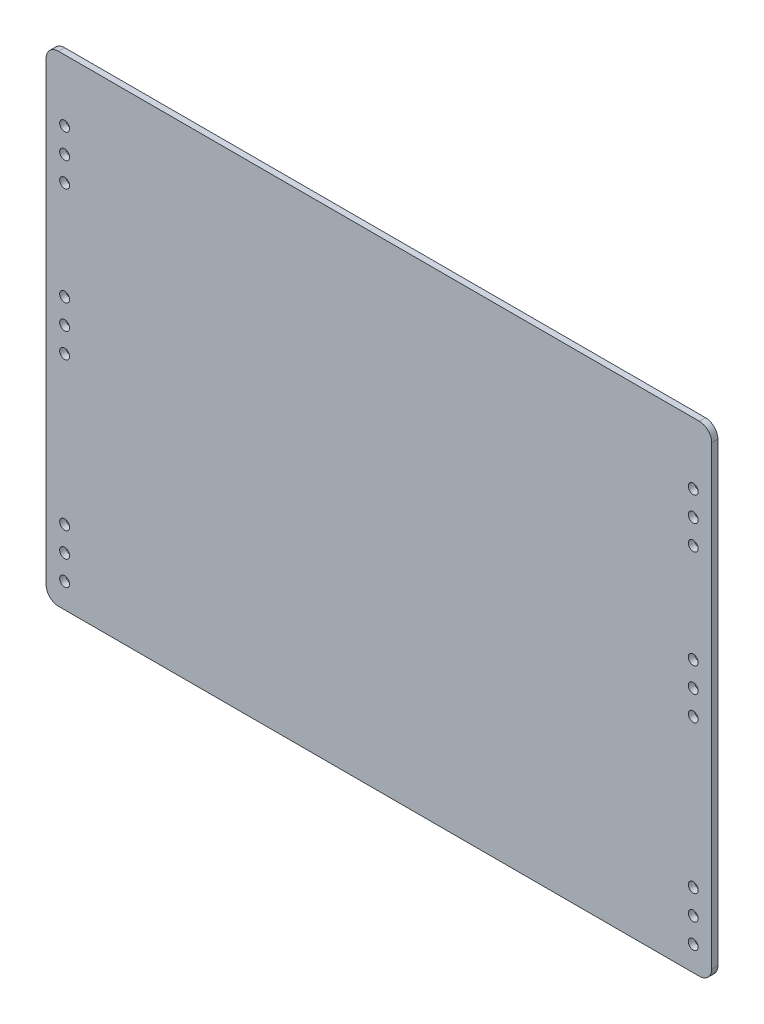
ISO-10303-21;
HEADER;
FILE_DESCRIPTION(('STEP AP214'),'2;1');
FILE_NAME('part.step','',(''),(''),'','','');
FILE_SCHEMA(('AUTOMOTIVE_DESIGN { 1 0 10303 214 1 1 1 1 }'));
ENDSEC;
DATA;
#1=APPLICATION_CONTEXT('core data for automotive mechanical design processes');
#2=APPLICATION_PROTOCOL_DEFINITION('international standard','automotive_design',2000,#1);
#3=PRODUCT_CONTEXT('',#1,'mechanical');
#4=PRODUCT('Part','Part','',(#3));
#5=PRODUCT_RELATED_PRODUCT_CATEGORY('part','',(#4));
#6=PRODUCT_DEFINITION_FORMATION('','',#4);
#7=PRODUCT_DEFINITION_CONTEXT('part definition',#1,'design');
#8=PRODUCT_DEFINITION('design','',#6,#7);
#9=PRODUCT_DEFINITION_SHAPE('','',#8);
#10=(LENGTH_UNIT() NAMED_UNIT(*) SI_UNIT(.MILLI.,.METRE.));
#11=(NAMED_UNIT(*) PLANE_ANGLE_UNIT() SI_UNIT($,.RADIAN.));
#12=(NAMED_UNIT(*) SI_UNIT($,.STERADIAN.) SOLID_ANGLE_UNIT());
#13=UNCERTAINTY_MEASURE_WITH_UNIT(LENGTH_MEASURE(1.E-05),#10,'distance_accuracy_value','');
#14=(GEOMETRIC_REPRESENTATION_CONTEXT(3) GLOBAL_UNCERTAINTY_ASSIGNED_CONTEXT((#13)) GLOBAL_UNIT_ASSIGNED_CONTEXT((#10,
#11,#12)) REPRESENTATION_CONTEXT('',''));
#15=CARTESIAN_POINT('',(0.,0.,0.));
#16=DIRECTION('',(0.,0.,1.));
#17=DIRECTION('',(1.,0.,0.));
#18=AXIS2_PLACEMENT_3D('',#15,#16,#17);
#19=CARTESIAN_POINT('',(0.,0.,-3.175));
#20=DIRECTION('',(0.,0.,1.));
#21=DIRECTION('',(-1.,0.,0.));
#22=AXIS2_PLACEMENT_3D('',#19,#20,#21);
#23=PLANE('',#22);
#24=DIRECTION('',(-1.,0.,0.));
#25=VECTOR('',#24,1.);
#26=CARTESIAN_POINT('',(0.,247.65,-3.175));
#27=LINE('',#26,#25);
#28=CARTESIAN_POINT('',(336.55,247.65,-3.175));
#29=VERTEX_POINT('',#28);
#30=CARTESIAN_POINT('',(6.35,247.65,-3.175));
#31=VERTEX_POINT('',#30);
#32=EDGE_CURVE('E138',#29,#31,#27,.T.);
#33=ORIENTED_EDGE('',*,*,#32,.F.);
#34=CARTESIAN_POINT('',(336.55,241.3,-3.175));
#35=DIRECTION('',(0.,0.,-1.));
#36=DIRECTION('',(-1.,0.,0.));
#37=AXIS2_PLACEMENT_3D('',#34,#35,#36);
#38=CIRCLE('',#37,6.35);
#39=CARTESIAN_POINT('',(342.9,241.3,-3.175));
#40=VERTEX_POINT('',#39);
#41=EDGE_CURVE('E154',#40,#29,#38,.F.);
#42=ORIENTED_EDGE('',*,*,#41,.F.);
#43=DIRECTION('',(0.,1.,0.));
#44=VECTOR('',#43,1.);
#45=CARTESIAN_POINT('',(342.9,0.,-3.175));
#46=LINE('',#45,#44);
#47=CARTESIAN_POINT('',(342.9,6.35,-3.175));
#48=VERTEX_POINT('',#47);
#49=EDGE_CURVE('E177',#48,#40,#46,.T.);
#50=ORIENTED_EDGE('',*,*,#49,.F.);
#51=CARTESIAN_POINT('',(336.55,6.35,-3.175));
#52=DIRECTION('',(0.,0.,-1.));
#53=DIRECTION('',(-1.,0.,0.));
#54=AXIS2_PLACEMENT_3D('',#51,#52,#53);
#55=CIRCLE('',#54,6.35);
#56=CARTESIAN_POINT('',(336.55,0.,-3.175));
#57=VERTEX_POINT('',#56);
#58=EDGE_CURVE('E159',#57,#48,#55,.F.);
#59=ORIENTED_EDGE('',*,*,#58,.F.);
#60=DIRECTION('',(1.,0.,0.));
#61=VECTOR('',#60,1.);
#62=CARTESIAN_POINT('',(0.,0.,-3.175));
#63=LINE('',#62,#61);
#64=CARTESIAN_POINT('',(6.35,0.,-3.175));
#65=VERTEX_POINT('',#64);
#66=EDGE_CURVE('E185',#65,#57,#63,.T.);
#67=ORIENTED_EDGE('',*,*,#66,.F.);
#68=CARTESIAN_POINT('',(6.35,6.35,-3.175));
#69=DIRECTION('',(0.,0.,-1.));
#70=DIRECTION('',(-1.,0.,0.));
#71=AXIS2_PLACEMENT_3D('',#68,#69,#70);
#72=CIRCLE('',#71,6.35);
#73=CARTESIAN_POINT('',(0.,6.35,-3.175));
#74=VERTEX_POINT('',#73);
#75=EDGE_CURVE('E156',#74,#65,#72,.F.);
#76=ORIENTED_EDGE('',*,*,#75,.F.);
#77=DIRECTION('',(0.,-1.,0.));
#78=VECTOR('',#77,1.);
#79=CARTESIAN_POINT('',(0.,0.,-3.175));
#80=LINE('',#79,#78);
#81=CARTESIAN_POINT('',(0.,241.3,-3.175));
#82=VERTEX_POINT('',#81);
#83=EDGE_CURVE('E144',#82,#74,#80,.T.);
#84=ORIENTED_EDGE('',*,*,#83,.F.);
#85=CARTESIAN_POINT('',(6.35,241.3,-3.175));
#86=DIRECTION('',(0.,0.,-1.));
#87=DIRECTION('',(-1.,0.,0.));
#88=AXIS2_PLACEMENT_3D('',#85,#86,#87);
#89=CIRCLE('',#88,6.35);
#90=EDGE_CURVE('E106',#31,#82,#89,.F.);
#91=ORIENTED_EDGE('',*,*,#90,.F.);
#92=EDGE_LOOP('',(#33,#42,#50,#59,#67,#76,#84,#91));
#93=FACE_BOUND('',#92,.T.);
#94=CARTESIAN_POINT('',(9.52500000000003,12.7000000000001,-3.175));
#95=DIRECTION('',(0.,0.,1.));
#96=DIRECTION('',(1.,0.,0.));
#97=AXIS2_PLACEMENT_3D('',#94,#95,#96);
#98=CIRCLE('',#97,2.5527);
#99=CARTESIAN_POINT('',(12.0777,12.7000000000001,-3.175));
#100=VERTEX_POINT('',#99);
#101=EDGE_CURVE('E129',#100,#100,#98,.T.);
#102=ORIENTED_EDGE('',*,*,#101,.T.);
#103=EDGE_LOOP('',(#102));
#104=FACE_BOUND('',#103,.T.);
#105=CARTESIAN_POINT('',(9.52500000000003,25.4000000000001,-3.175));
#106=DIRECTION('',(0.,0.,1.));
#107=DIRECTION('',(1.,0.,0.));
#108=AXIS2_PLACEMENT_3D('',#105,#106,#107);
#109=CIRCLE('',#108,2.5527);
#110=CARTESIAN_POINT('',(12.0777,25.4000000000001,-3.175));
#111=VERTEX_POINT('',#110);
#112=EDGE_CURVE('E190',#111,#111,#109,.T.);
#113=ORIENTED_EDGE('',*,*,#112,.T.);
#114=EDGE_LOOP('',(#113));
#115=FACE_BOUND('',#114,.T.);
#116=CARTESIAN_POINT('',(9.52500000000003,38.1000000000001,-3.175));
#117=DIRECTION('',(0.,0.,1.));
#118=DIRECTION('',(1.,0.,0.));
#119=AXIS2_PLACEMENT_3D('',#116,#117,#118);
#120=CIRCLE('',#119,2.5527);
#121=CARTESIAN_POINT('',(12.0777,38.1000000000001,-3.175));
#122=VERTEX_POINT('',#121);
#123=EDGE_CURVE('E195',#122,#122,#120,.T.);
#124=ORIENTED_EDGE('',*,*,#123,.T.);
#125=EDGE_LOOP('',(#124));
#126=FACE_BOUND('',#125,.T.);
#127=CARTESIAN_POINT('',(9.52500000000002,114.3,-3.175));
#128=DIRECTION('',(0.,0.,1.));
#129=DIRECTION('',(1.,0.,0.));
#130=AXIS2_PLACEMENT_3D('',#127,#128,#129);
#131=CIRCLE('',#130,2.55269999999999);
#132=CARTESIAN_POINT('',(12.0777,114.3,-3.175));
#133=VERTEX_POINT('',#132);
#134=EDGE_CURVE('E201',#133,#133,#131,.T.);
#135=ORIENTED_EDGE('',*,*,#134,.T.);
#136=EDGE_LOOP('',(#135));
#137=FACE_BOUND('',#136,.T.);
#138=CARTESIAN_POINT('',(9.52500000000002,127.,-3.175));
#139=DIRECTION('',(0.,0.,1.));
#140=DIRECTION('',(1.,0.,0.));
#141=AXIS2_PLACEMENT_3D('',#138,#139,#140);
#142=CIRCLE('',#141,2.5527);
#143=CARTESIAN_POINT('',(12.0777,127.,-3.175));
#144=VERTEX_POINT('',#143);
#145=EDGE_CURVE('E207',#144,#144,#142,.T.);
#146=ORIENTED_EDGE('',*,*,#145,.T.);
#147=EDGE_LOOP('',(#146));
#148=FACE_BOUND('',#147,.T.);
#149=CARTESIAN_POINT('',(9.52500000000002,139.7,-3.175));
#150=DIRECTION('',(0.,0.,1.));
#151=DIRECTION('',(1.,0.,0.));
#152=AXIS2_PLACEMENT_3D('',#149,#150,#151);
#153=CIRCLE('',#152,2.55270000000001);
#154=CARTESIAN_POINT('',(12.0777,139.7,-3.175));
#155=VERTEX_POINT('',#154);
#156=EDGE_CURVE('E213',#155,#155,#153,.T.);
#157=ORIENTED_EDGE('',*,*,#156,.T.);
#158=EDGE_LOOP('',(#157));
#159=FACE_BOUND('',#158,.T.);
#160=CARTESIAN_POINT('',(9.52500000000001,215.9,-3.175));
#161=DIRECTION('',(0.,0.,1.));
#162=DIRECTION('',(1.,0.,0.));
#163=AXIS2_PLACEMENT_3D('',#160,#161,#162);
#164=CIRCLE('',#163,2.55270000000001);
#165=CARTESIAN_POINT('',(12.0777,215.9,-3.175));
#166=VERTEX_POINT('',#165);
#167=EDGE_CURVE('E219',#166,#166,#164,.T.);
#168=ORIENTED_EDGE('',*,*,#167,.T.);
#169=EDGE_LOOP('',(#168));
#170=FACE_BOUND('',#169,.T.);
#171=CARTESIAN_POINT('',(9.52500000000001,203.2,-3.175));
#172=DIRECTION('',(0.,0.,1.));
#173=DIRECTION('',(1.,0.,0.));
#174=AXIS2_PLACEMENT_3D('',#171,#172,#173);
#175=CIRCLE('',#174,2.55270000000001);
#176=CARTESIAN_POINT('',(12.0777,203.2,-3.175));
#177=VERTEX_POINT('',#176);
#178=EDGE_CURVE('E225',#177,#177,#175,.T.);
#179=ORIENTED_EDGE('',*,*,#178,.T.);
#180=EDGE_LOOP('',(#179));
#181=FACE_BOUND('',#180,.T.);
#182=CARTESIAN_POINT('',(9.52500000000001,190.5,-3.175));
#183=DIRECTION('',(0.,0.,1.));
#184=DIRECTION('',(1.,0.,0.));
#185=AXIS2_PLACEMENT_3D('',#182,#183,#184);
#186=CIRCLE('',#185,2.55270000000001);
#187=CARTESIAN_POINT('',(12.0777,190.5,-3.175));
#188=VERTEX_POINT('',#187);
#189=EDGE_CURVE('E231',#188,#188,#186,.T.);
#190=ORIENTED_EDGE('',*,*,#189,.T.);
#191=EDGE_LOOP('',(#190));
#192=FACE_BOUND('',#191,.T.);
#193=CARTESIAN_POINT('',(333.375,215.9,-3.175));
#194=DIRECTION('',(0.,0.,1.));
#195=DIRECTION('',(-1.,0.,0.));
#196=AXIS2_PLACEMENT_3D('',#193,#194,#195);
#197=CIRCLE('',#196,2.55269999999998);
#198=CARTESIAN_POINT('',(330.8223,215.9,-3.175));
#199=VERTEX_POINT('',#198);
#200=EDGE_CURVE('E237',#199,#199,#197,.T.);
#201=ORIENTED_EDGE('',*,*,#200,.T.);
#202=EDGE_LOOP('',(#201));
#203=FACE_BOUND('',#202,.T.);
#204=CARTESIAN_POINT('',(333.375,203.2,-3.175));
#205=DIRECTION('',(0.,0.,1.));
#206=DIRECTION('',(-1.,0.,0.));
#207=AXIS2_PLACEMENT_3D('',#204,#205,#206);
#208=CIRCLE('',#207,2.55269999999993);
#209=CARTESIAN_POINT('',(330.8223,203.2,-3.175));
#210=VERTEX_POINT('',#209);
#211=EDGE_CURVE('E243',#210,#210,#208,.T.);
#212=ORIENTED_EDGE('',*,*,#211,.T.);
#213=EDGE_LOOP('',(#212));
#214=FACE_BOUND('',#213,.T.);
#215=CARTESIAN_POINT('',(333.375,190.5,-3.175));
#216=DIRECTION('',(0.,0.,1.));
#217=DIRECTION('',(-1.,0.,0.));
#218=AXIS2_PLACEMENT_3D('',#215,#216,#217);
#219=CIRCLE('',#218,2.55269999999998);
#220=CARTESIAN_POINT('',(330.8223,190.5,-3.175));
#221=VERTEX_POINT('',#220);
#222=EDGE_CURVE('E249',#221,#221,#219,.T.);
#223=ORIENTED_EDGE('',*,*,#222,.T.);
#224=EDGE_LOOP('',(#223));
#225=FACE_BOUND('',#224,.T.);
#226=CARTESIAN_POINT('',(333.375,139.7,-3.175));
#227=DIRECTION('',(0.,0.,1.));
#228=DIRECTION('',(-1.,0.,0.));
#229=AXIS2_PLACEMENT_3D('',#226,#227,#228);
#230=CIRCLE('',#229,2.55270000000004);
#231=CARTESIAN_POINT('',(330.8223,139.7,-3.175));
#232=VERTEX_POINT('',#231);
#233=EDGE_CURVE('E255',#232,#232,#230,.T.);
#234=ORIENTED_EDGE('',*,*,#233,.T.);
#235=EDGE_LOOP('',(#234));
#236=FACE_BOUND('',#235,.T.);
#237=CARTESIAN_POINT('',(333.375,127.,-3.175));
#238=DIRECTION('',(0.,0.,1.));
#239=DIRECTION('',(-1.,0.,0.));
#240=AXIS2_PLACEMENT_3D('',#237,#238,#239);
#241=CIRCLE('',#240,2.55270000000004);
#242=CARTESIAN_POINT('',(330.8223,127.,-3.175));
#243=VERTEX_POINT('',#242);
#244=EDGE_CURVE('E261',#243,#243,#241,.T.);
#245=ORIENTED_EDGE('',*,*,#244,.T.);
#246=EDGE_LOOP('',(#245));
#247=FACE_BOUND('',#246,.T.);
#248=CARTESIAN_POINT('',(333.375,114.3,-3.175));
#249=DIRECTION('',(0.,0.,1.));
#250=DIRECTION('',(-1.,0.,0.));
#251=AXIS2_PLACEMENT_3D('',#248,#249,#250);
#252=CIRCLE('',#251,2.55270000000004);
#253=CARTESIAN_POINT('',(330.8223,114.3,-3.175));
#254=VERTEX_POINT('',#253);
#255=EDGE_CURVE('E267',#254,#254,#252,.T.);
#256=ORIENTED_EDGE('',*,*,#255,.T.);
#257=EDGE_LOOP('',(#256));
#258=FACE_BOUND('',#257,.T.);
#259=CARTESIAN_POINT('',(333.375,38.1000000000001,-3.175));
#260=DIRECTION('',(0.,0.,1.));
#261=DIRECTION('',(-1.,0.,0.));
#262=AXIS2_PLACEMENT_3D('',#259,#260,#261);
#263=CIRCLE('',#262,2.55269999999998);
#264=CARTESIAN_POINT('',(330.8223,38.1000000000001,-3.175));
#265=VERTEX_POINT('',#264);
#266=EDGE_CURVE('E273',#265,#265,#263,.T.);
#267=ORIENTED_EDGE('',*,*,#266,.T.);
#268=EDGE_LOOP('',(#267));
#269=FACE_BOUND('',#268,.T.);
#270=CARTESIAN_POINT('',(333.375,25.4000000000001,-3.175));
#271=DIRECTION('',(0.,0.,1.));
#272=DIRECTION('',(-1.,0.,0.));
#273=AXIS2_PLACEMENT_3D('',#270,#271,#272);
#274=CIRCLE('',#273,2.55269999999998);
#275=CARTESIAN_POINT('',(330.8223,25.4000000000001,-3.175));
#276=VERTEX_POINT('',#275);
#277=EDGE_CURVE('E279',#276,#276,#274,.T.);
#278=ORIENTED_EDGE('',*,*,#277,.T.);
#279=EDGE_LOOP('',(#278));
#280=FACE_BOUND('',#279,.T.);
#281=CARTESIAN_POINT('',(333.375,12.7000000000001,-3.175));
#282=DIRECTION('',(0.,0.,1.));
#283=DIRECTION('',(-1.,0.,0.));
#284=AXIS2_PLACEMENT_3D('',#281,#282,#283);
#285=CIRCLE('',#284,2.55269999999998);
#286=CARTESIAN_POINT('',(330.8223,12.7000000000001,-3.175));
#287=VERTEX_POINT('',#286);
#288=EDGE_CURVE('E285',#287,#287,#285,.T.);
#289=ORIENTED_EDGE('',*,*,#288,.T.);
#290=EDGE_LOOP('',(#289));
#291=FACE_BOUND('',#290,.T.);
#292=ADVANCED_FACE('F35',(#93,#104,#115,#126,#137,#148,#159,#170,#181,#192,#203,#214,#225,#236,
#247,#258,#269,#280,#291),#23,.F.);
#293=CARTESIAN_POINT('',(0.,0.,0.));
#294=DIRECTION('',(0.,0.,1.));
#295=DIRECTION('',(-1.,0.,0.));
#296=AXIS2_PLACEMENT_3D('',#293,#294,#295);
#297=PLANE('',#296);
#298=CARTESIAN_POINT('',(333.375,25.4000000000001,0.));
#299=DIRECTION('',(0.,0.,1.));
#300=DIRECTION('',(-1.,0.,0.));
#301=AXIS2_PLACEMENT_3D('',#298,#299,#300);
#302=CIRCLE('',#301,2.55269999999998);
#303=CARTESIAN_POINT('',(330.8223,25.4000000000001,0.));
#304=VERTEX_POINT('',#303);
#305=EDGE_CURVE('E282',#304,#304,#302,.T.);
#306=ORIENTED_EDGE('',*,*,#305,.F.);
#307=EDGE_LOOP('',(#306));
#308=FACE_BOUND('',#307,.T.);
#309=CARTESIAN_POINT('',(333.375,114.3,0.));
#310=DIRECTION('',(0.,0.,1.));
#311=DIRECTION('',(-1.,0.,0.));
#312=AXIS2_PLACEMENT_3D('',#309,#310,#311);
#313=CIRCLE('',#312,2.55270000000004);
#314=CARTESIAN_POINT('',(330.8223,114.3,0.));
#315=VERTEX_POINT('',#314);
#316=EDGE_CURVE('E270',#315,#315,#313,.T.);
#317=ORIENTED_EDGE('',*,*,#316,.F.);
#318=EDGE_LOOP('',(#317));
#319=FACE_BOUND('',#318,.T.);
#320=CARTESIAN_POINT('',(333.375,139.7,0.));
#321=DIRECTION('',(0.,0.,1.));
#322=DIRECTION('',(-1.,0.,0.));
#323=AXIS2_PLACEMENT_3D('',#320,#321,#322);
#324=CIRCLE('',#323,2.55270000000004);
#325=CARTESIAN_POINT('',(330.8223,139.7,0.));
#326=VERTEX_POINT('',#325);
#327=EDGE_CURVE('E258',#326,#326,#324,.T.);
#328=ORIENTED_EDGE('',*,*,#327,.F.);
#329=EDGE_LOOP('',(#328));
#330=FACE_BOUND('',#329,.T.);
#331=CARTESIAN_POINT('',(333.375,203.2,0.));
#332=DIRECTION('',(0.,0.,1.));
#333=DIRECTION('',(-1.,0.,0.));
#334=AXIS2_PLACEMENT_3D('',#331,#332,#333);
#335=CIRCLE('',#334,2.55269999999993);
#336=CARTESIAN_POINT('',(330.8223,203.2,0.));
#337=VERTEX_POINT('',#336);
#338=EDGE_CURVE('E246',#337,#337,#335,.T.);
#339=ORIENTED_EDGE('',*,*,#338,.F.);
#340=EDGE_LOOP('',(#339));
#341=FACE_BOUND('',#340,.T.);
#342=CARTESIAN_POINT('',(9.52500000000001,190.5,0.));
#343=DIRECTION('',(0.,0.,1.));
#344=DIRECTION('',(1.,0.,0.));
#345=AXIS2_PLACEMENT_3D('',#342,#343,#344);
#346=CIRCLE('',#345,2.55270000000001);
#347=CARTESIAN_POINT('',(12.0777,190.5,0.));
#348=VERTEX_POINT('',#347);
#349=EDGE_CURVE('E234',#348,#348,#346,.T.);
#350=ORIENTED_EDGE('',*,*,#349,.F.);
#351=EDGE_LOOP('',(#350));
#352=FACE_BOUND('',#351,.T.);
#353=CARTESIAN_POINT('',(9.52500000000001,215.9,0.));
#354=DIRECTION('',(0.,0.,1.));
#355=DIRECTION('',(1.,0.,0.));
#356=AXIS2_PLACEMENT_3D('',#353,#354,#355);
#357=CIRCLE('',#356,2.55270000000001);
#358=CARTESIAN_POINT('',(12.0777,215.9,0.));
#359=VERTEX_POINT('',#358);
#360=EDGE_CURVE('E222',#359,#359,#357,.T.);
#361=ORIENTED_EDGE('',*,*,#360,.F.);
#362=EDGE_LOOP('',(#361));
#363=FACE_BOUND('',#362,.T.);
#364=CARTESIAN_POINT('',(9.52500000000002,127.,0.));
#365=DIRECTION('',(0.,0.,1.));
#366=DIRECTION('',(1.,0.,0.));
#367=AXIS2_PLACEMENT_3D('',#364,#365,#366);
#368=CIRCLE('',#367,2.5527);
#369=CARTESIAN_POINT('',(12.0777,127.,0.));
#370=VERTEX_POINT('',#369);
#371=EDGE_CURVE('E210',#370,#370,#368,.T.);
#372=ORIENTED_EDGE('',*,*,#371,.F.);
#373=EDGE_LOOP('',(#372));
#374=FACE_BOUND('',#373,.T.);
#375=CARTESIAN_POINT('',(9.52500000000003,38.1000000000001,0.));
#376=DIRECTION('',(0.,0.,1.));
#377=DIRECTION('',(1.,0.,0.));
#378=AXIS2_PLACEMENT_3D('',#375,#376,#377);
#379=CIRCLE('',#378,2.5527);
#380=CARTESIAN_POINT('',(12.0777,38.1000000000001,0.));
#381=VERTEX_POINT('',#380);
#382=EDGE_CURVE('E198',#381,#381,#379,.T.);
#383=ORIENTED_EDGE('',*,*,#382,.F.);
#384=EDGE_LOOP('',(#383));
#385=FACE_BOUND('',#384,.T.);
#386=CARTESIAN_POINT('',(9.52500000000003,12.7000000000001,0.));
#387=DIRECTION('',(0.,0.,1.));
#388=DIRECTION('',(1.,0.,0.));
#389=AXIS2_PLACEMENT_3D('',#386,#387,#388);
#390=CIRCLE('',#389,2.5527);
#391=CARTESIAN_POINT('',(12.0777,12.7000000000001,0.));
#392=VERTEX_POINT('',#391);
#393=EDGE_CURVE('E135',#392,#392,#390,.T.);
#394=ORIENTED_EDGE('',*,*,#393,.F.);
#395=EDGE_LOOP('',(#394));
#396=FACE_BOUND('',#395,.T.);
#397=DIRECTION('',(0.,-1.,0.));
#398=VECTOR('',#397,1.);
#399=CARTESIAN_POINT('',(0.,0.,0.));
#400=LINE('',#399,#398);
#401=CARTESIAN_POINT('',(0.,241.3,0.));
#402=VERTEX_POINT('',#401);
#403=CARTESIAN_POINT('',(0.,6.35,0.));
#404=VERTEX_POINT('',#403);
#405=EDGE_CURVE('E119',#402,#404,#400,.T.);
#406=ORIENTED_EDGE('',*,*,#405,.T.);
#407=CARTESIAN_POINT('',(6.35,6.35,0.));
#408=DIRECTION('',(0.,0.,-1.));
#409=DIRECTION('',(-1.,0.,0.));
#410=AXIS2_PLACEMENT_3D('',#407,#408,#409);
#411=CIRCLE('',#410,6.35);
#412=CARTESIAN_POINT('',(6.35,0.,0.));
#413=VERTEX_POINT('',#412);
#414=EDGE_CURVE('E147',#413,#404,#411,.T.);
#415=ORIENTED_EDGE('',*,*,#414,.F.);
#416=DIRECTION('',(1.,0.,0.));
#417=VECTOR('',#416,1.);
#418=CARTESIAN_POINT('',(0.,0.,0.));
#419=LINE('',#418,#417);
#420=CARTESIAN_POINT('',(336.55,0.,0.));
#421=VERTEX_POINT('',#420);
#422=EDGE_CURVE('E128',#413,#421,#419,.T.);
#423=ORIENTED_EDGE('',*,*,#422,.T.);
#424=CARTESIAN_POINT('',(336.55,6.35,0.));
#425=DIRECTION('',(0.,0.,-1.));
#426=DIRECTION('',(-1.,0.,0.));
#427=AXIS2_PLACEMENT_3D('',#424,#425,#426);
#428=CIRCLE('',#427,6.35);
#429=CARTESIAN_POINT('',(342.9,6.35,0.));
#430=VERTEX_POINT('',#429);
#431=EDGE_CURVE('E124',#430,#421,#428,.T.);
#432=ORIENTED_EDGE('',*,*,#431,.F.);
#433=DIRECTION('',(0.,1.,0.));
#434=VECTOR('',#433,1.);
#435=CARTESIAN_POINT('',(342.9,0.,0.));
#436=LINE('',#435,#434);
#437=CARTESIAN_POINT('',(342.9,241.3,0.));
#438=VERTEX_POINT('',#437);
#439=EDGE_CURVE('E132',#430,#438,#436,.T.);
#440=ORIENTED_EDGE('',*,*,#439,.T.);
#441=CARTESIAN_POINT('',(336.55,241.3,0.));
#442=DIRECTION('',(0.,0.,-1.));
#443=DIRECTION('',(-1.,0.,0.));
#444=AXIS2_PLACEMENT_3D('',#441,#442,#443);
#445=CIRCLE('',#444,6.35);
#446=CARTESIAN_POINT('',(336.55,247.65,0.));
#447=VERTEX_POINT('',#446);
#448=EDGE_CURVE('E111',#447,#438,#445,.T.);
#449=ORIENTED_EDGE('',*,*,#448,.F.);
#450=DIRECTION('',(-1.,0.,0.));
#451=VECTOR('',#450,1.);
#452=CARTESIAN_POINT('',(0.,247.65,0.));
#453=LINE('',#452,#451);
#454=CARTESIAN_POINT('',(6.35,247.65,0.));
#455=VERTEX_POINT('',#454);
#456=EDGE_CURVE('E122',#447,#455,#453,.T.);
#457=ORIENTED_EDGE('',*,*,#456,.T.);
#458=CARTESIAN_POINT('',(6.35,241.3,0.));
#459=DIRECTION('',(0.,0.,-1.));
#460=DIRECTION('',(-1.,0.,0.));
#461=AXIS2_PLACEMENT_3D('',#458,#459,#460);
#462=CIRCLE('',#461,6.35);
#463=EDGE_CURVE('E103',#402,#455,#462,.T.);
#464=ORIENTED_EDGE('',*,*,#463,.F.);
#465=EDGE_LOOP('',(#406,#415,#423,#432,#440,#449,#457,#464));
#466=FACE_BOUND('',#465,.T.);
#467=CARTESIAN_POINT('',(9.52500000000003,25.4000000000001,0.));
#468=DIRECTION('',(0.,0.,1.));
#469=DIRECTION('',(1.,0.,0.));
#470=AXIS2_PLACEMENT_3D('',#467,#468,#469);
#471=CIRCLE('',#470,2.5527);
#472=CARTESIAN_POINT('',(12.0777,25.4000000000001,0.));
#473=VERTEX_POINT('',#472);
#474=EDGE_CURVE('E192',#473,#473,#471,.T.);
#475=ORIENTED_EDGE('',*,*,#474,.F.);
#476=EDGE_LOOP('',(#475));
#477=FACE_BOUND('',#476,.T.);
#478=CARTESIAN_POINT('',(9.52500000000002,114.3,0.));
#479=DIRECTION('',(0.,0.,1.));
#480=DIRECTION('',(1.,0.,0.));
#481=AXIS2_PLACEMENT_3D('',#478,#479,#480);
#482=CIRCLE('',#481,2.55269999999999);
#483=CARTESIAN_POINT('',(12.0777,114.3,0.));
#484=VERTEX_POINT('',#483);
#485=EDGE_CURVE('E204',#484,#484,#482,.T.);
#486=ORIENTED_EDGE('',*,*,#485,.F.);
#487=EDGE_LOOP('',(#486));
#488=FACE_BOUND('',#487,.T.);
#489=CARTESIAN_POINT('',(9.52500000000002,139.7,0.));
#490=DIRECTION('',(0.,0.,1.));
#491=DIRECTION('',(1.,0.,0.));
#492=AXIS2_PLACEMENT_3D('',#489,#490,#491);
#493=CIRCLE('',#492,2.55270000000001);
#494=CARTESIAN_POINT('',(12.0777,139.7,0.));
#495=VERTEX_POINT('',#494);
#496=EDGE_CURVE('E216',#495,#495,#493,.T.);
#497=ORIENTED_EDGE('',*,*,#496,.F.);
#498=EDGE_LOOP('',(#497));
#499=FACE_BOUND('',#498,.T.);
#500=CARTESIAN_POINT('',(9.52500000000001,203.2,0.));
#501=DIRECTION('',(0.,0.,1.));
#502=DIRECTION('',(1.,0.,0.));
#503=AXIS2_PLACEMENT_3D('',#500,#501,#502);
#504=CIRCLE('',#503,2.55270000000001);
#505=CARTESIAN_POINT('',(12.0777,203.2,0.));
#506=VERTEX_POINT('',#505);
#507=EDGE_CURVE('E228',#506,#506,#504,.T.);
#508=ORIENTED_EDGE('',*,*,#507,.F.);
#509=EDGE_LOOP('',(#508));
#510=FACE_BOUND('',#509,.T.);
#511=CARTESIAN_POINT('',(333.375,215.9,0.));
#512=DIRECTION('',(0.,0.,1.));
#513=DIRECTION('',(-1.,0.,0.));
#514=AXIS2_PLACEMENT_3D('',#511,#512,#513);
#515=CIRCLE('',#514,2.55269999999998);
#516=CARTESIAN_POINT('',(330.8223,215.9,0.));
#517=VERTEX_POINT('',#516);
#518=EDGE_CURVE('E240',#517,#517,#515,.T.);
#519=ORIENTED_EDGE('',*,*,#518,.F.);
#520=EDGE_LOOP('',(#519));
#521=FACE_BOUND('',#520,.T.);
#522=CARTESIAN_POINT('',(333.375,190.5,0.));
#523=DIRECTION('',(0.,0.,1.));
#524=DIRECTION('',(-1.,0.,0.));
#525=AXIS2_PLACEMENT_3D('',#522,#523,#524);
#526=CIRCLE('',#525,2.55269999999998);
#527=CARTESIAN_POINT('',(330.8223,190.5,0.));
#528=VERTEX_POINT('',#527);
#529=EDGE_CURVE('E252',#528,#528,#526,.T.);
#530=ORIENTED_EDGE('',*,*,#529,.F.);
#531=EDGE_LOOP('',(#530));
#532=FACE_BOUND('',#531,.T.);
#533=CARTESIAN_POINT('',(333.375,127.,0.));
#534=DIRECTION('',(0.,0.,1.));
#535=DIRECTION('',(-1.,0.,0.));
#536=AXIS2_PLACEMENT_3D('',#533,#534,#535);
#537=CIRCLE('',#536,2.55270000000004);
#538=CARTESIAN_POINT('',(330.8223,127.,0.));
#539=VERTEX_POINT('',#538);
#540=EDGE_CURVE('E264',#539,#539,#537,.T.);
#541=ORIENTED_EDGE('',*,*,#540,.F.);
#542=EDGE_LOOP('',(#541));
#543=FACE_BOUND('',#542,.T.);
#544=CARTESIAN_POINT('',(333.375,38.1000000000001,0.));
#545=DIRECTION('',(0.,0.,1.));
#546=DIRECTION('',(-1.,0.,0.));
#547=AXIS2_PLACEMENT_3D('',#544,#545,#546);
#548=CIRCLE('',#547,2.55269999999998);
#549=CARTESIAN_POINT('',(330.8223,38.1000000000001,0.));
#550=VERTEX_POINT('',#549);
#551=EDGE_CURVE('E276',#550,#550,#548,.T.);
#552=ORIENTED_EDGE('',*,*,#551,.F.);
#553=EDGE_LOOP('',(#552));
#554=FACE_BOUND('',#553,.T.);
#555=CARTESIAN_POINT('',(333.375,12.7000000000001,0.));
#556=DIRECTION('',(0.,0.,1.));
#557=DIRECTION('',(-1.,0.,0.));
#558=AXIS2_PLACEMENT_3D('',#555,#556,#557);
#559=CIRCLE('',#558,2.55269999999998);
#560=CARTESIAN_POINT('',(330.8223,12.7000000000001,0.));
#561=VERTEX_POINT('',#560);
#562=EDGE_CURVE('E288',#561,#561,#559,.T.);
#563=ORIENTED_EDGE('',*,*,#562,.F.);
#564=EDGE_LOOP('',(#563));
#565=FACE_BOUND('',#564,.T.);
#566=ADVANCED_FACE('F116',(#308,#319,#330,#341,#352,#363,#374,#385,#396,#466,#477,#488,#499,
#510,#521,#532,#543,#554,#565),#297,.T.);
#567=CARTESIAN_POINT('',(0.,0.,-3.175));
#568=DIRECTION('',(1.,0.,0.));
#569=DIRECTION('',(0.,0.,1.));
#570=AXIS2_PLACEMENT_3D('',#567,#568,#569);
#571=PLANE('',#570);
#572=ORIENTED_EDGE('',*,*,#83,.T.);
#573=DIRECTION('',(0.,0.,1.));
#574=VECTOR('',#573,1.);
#575=CARTESIAN_POINT('',(0.,6.35,-3.175));
#576=LINE('',#575,#574);
#577=EDGE_CURVE('E112',#404,#74,#576,.F.);
#578=ORIENTED_EDGE('',*,*,#577,.F.);
#579=ORIENTED_EDGE('',*,*,#405,.F.);
#580=DIRECTION('',(0.,0.,1.));
#581=VECTOR('',#580,1.);
#582=CARTESIAN_POINT('',(0.,241.3,-3.175));
#583=LINE('',#582,#581);
#584=EDGE_CURVE('E100',#82,#402,#583,.T.);
#585=ORIENTED_EDGE('',*,*,#584,.F.);
#586=EDGE_LOOP('',(#572,#578,#579,#585));
#587=FACE_BOUND('',#586,.T.);
#588=ADVANCED_FACE('F126',(#587),#571,.F.);
#589=CARTESIAN_POINT('',(0.,0.,-3.175));
#590=DIRECTION('',(0.,1.,0.));
#591=DIRECTION('',(0.,0.,-1.));
#592=AXIS2_PLACEMENT_3D('',#589,#590,#591);
#593=PLANE('',#592);
#594=ORIENTED_EDGE('',*,*,#422,.F.);
#595=DIRECTION('',(0.,0.,1.));
#596=VECTOR('',#595,1.);
#597=CARTESIAN_POINT('',(6.35,0.,-3.175));
#598=LINE('',#597,#596);
#599=EDGE_CURVE('E43',#65,#413,#598,.T.);
#600=ORIENTED_EDGE('',*,*,#599,.F.);
#601=ORIENTED_EDGE('',*,*,#66,.T.);
#602=DIRECTION('',(0.,0.,1.));
#603=VECTOR('',#602,1.);
#604=CARTESIAN_POINT('',(336.55,0.,-3.175));
#605=LINE('',#604,#603);
#606=EDGE_CURVE('E11',#421,#57,#605,.F.);
#607=ORIENTED_EDGE('',*,*,#606,.F.);
#608=EDGE_LOOP('',(#594,#600,#601,#607));
#609=FACE_BOUND('',#608,.T.);
#610=ADVANCED_FACE('F170',(#609),#593,.F.);
#611=CARTESIAN_POINT('',(342.9,0.,-3.175));
#612=DIRECTION('',(-1.,0.,0.));
#613=DIRECTION('',(0.,0.,-1.));
#614=AXIS2_PLACEMENT_3D('',#611,#612,#613);
#615=PLANE('',#614);
#616=ORIENTED_EDGE('',*,*,#49,.T.);
#617=DIRECTION('',(0.,0.,1.));
#618=VECTOR('',#617,1.);
#619=CARTESIAN_POINT('',(342.9,241.3,-3.175));
#620=LINE('',#619,#618);
#621=EDGE_CURVE('E50',#438,#40,#620,.F.);
#622=ORIENTED_EDGE('',*,*,#621,.F.);
#623=ORIENTED_EDGE('',*,*,#439,.F.);
#624=DIRECTION('',(0.,0.,1.));
#625=VECTOR('',#624,1.);
#626=CARTESIAN_POINT('',(342.9,6.35,-3.175));
#627=LINE('',#626,#625);
#628=EDGE_CURVE('E57',#48,#430,#627,.T.);
#629=ORIENTED_EDGE('',*,*,#628,.F.);
#630=EDGE_LOOP('',(#616,#622,#623,#629));
#631=FACE_BOUND('',#630,.T.);
#632=ADVANCED_FACE('F176',(#631),#615,.F.);
#633=CARTESIAN_POINT('',(0.,247.65,-3.175));
#634=DIRECTION('',(0.,-1.,0.));
#635=DIRECTION('',(0.,0.,1.));
#636=AXIS2_PLACEMENT_3D('',#633,#634,#635);
#637=PLANE('',#636);
#638=ORIENTED_EDGE('',*,*,#456,.F.);
#639=DIRECTION('',(0.,0.,1.));
#640=VECTOR('',#639,1.);
#641=CARTESIAN_POINT('',(336.55,247.65,-3.175));
#642=LINE('',#641,#640);
#643=EDGE_CURVE('E123',#29,#447,#642,.T.);
#644=ORIENTED_EDGE('',*,*,#643,.F.);
#645=ORIENTED_EDGE('',*,*,#32,.T.);
#646=DIRECTION('',(0.,0.,1.));
#647=VECTOR('',#646,1.);
#648=CARTESIAN_POINT('',(6.35,247.65,-3.175));
#649=LINE('',#648,#647);
#650=EDGE_CURVE('E152',#455,#31,#649,.F.);
#651=ORIENTED_EDGE('',*,*,#650,.F.);
#652=EDGE_LOOP('',(#638,#644,#645,#651));
#653=FACE_BOUND('',#652,.T.);
#654=ADVANCED_FACE('F182',(#653),#637,.F.);
#655=CARTESIAN_POINT('',(9.52500000000003,12.7000000000001,-3.175));
#656=DIRECTION('',(0.,0.,1.));
#657=DIRECTION('',(-1.,0.,0.));
#658=AXIS2_PLACEMENT_3D('',#655,#656,#657);
#659=CYLINDRICAL_SURFACE('',#658,2.5527);
#660=ORIENTED_EDGE('',*,*,#101,.F.);
#661=EDGE_LOOP('',(#660));
#662=FACE_BOUND('',#661,.T.);
#663=ORIENTED_EDGE('',*,*,#393,.T.);
#664=EDGE_LOOP('',(#663));
#665=FACE_BOUND('',#664,.T.);
#666=ADVANCED_FACE('F317',(#662,#665),#659,.F.);
#667=CARTESIAN_POINT('',(9.52500000000003,25.4000000000001,-3.175));
#668=DIRECTION('',(0.,0.,1.));
#669=DIRECTION('',(-1.,0.,0.));
#670=AXIS2_PLACEMENT_3D('',#667,#668,#669);
#671=CYLINDRICAL_SURFACE('',#670,2.5527);
#672=ORIENTED_EDGE('',*,*,#112,.F.);
#673=EDGE_LOOP('',(#672));
#674=FACE_BOUND('',#673,.T.);
#675=ORIENTED_EDGE('',*,*,#474,.T.);
#676=EDGE_LOOP('',(#675));
#677=FACE_BOUND('',#676,.T.);
#678=ADVANCED_FACE('F502',(#674,#677),#671,.F.);
#679=CARTESIAN_POINT('',(9.52500000000003,38.1000000000001,-3.175));
#680=DIRECTION('',(0.,0.,1.));
#681=DIRECTION('',(-1.,0.,0.));
#682=AXIS2_PLACEMENT_3D('',#679,#680,#681);
#683=CYLINDRICAL_SURFACE('',#682,2.5527);
#684=ORIENTED_EDGE('',*,*,#123,.F.);
#685=EDGE_LOOP('',(#684));
#686=FACE_BOUND('',#685,.T.);
#687=ORIENTED_EDGE('',*,*,#382,.T.);
#688=EDGE_LOOP('',(#687));
#689=FACE_BOUND('',#688,.T.);
#690=ADVANCED_FACE('F492',(#686,#689),#683,.F.);
#691=CARTESIAN_POINT('',(9.52500000000002,114.3,-3.175));
#692=DIRECTION('',(0.,0.,1.));
#693=DIRECTION('',(-1.,0.,0.));
#694=AXIS2_PLACEMENT_3D('',#691,#692,#693);
#695=CYLINDRICAL_SURFACE('',#694,2.55269999999999);
#696=ORIENTED_EDGE('',*,*,#134,.F.);
#697=EDGE_LOOP('',(#696));
#698=FACE_BOUND('',#697,.T.);
#699=ORIENTED_EDGE('',*,*,#485,.T.);
#700=EDGE_LOOP('',(#699));
#701=FACE_BOUND('',#700,.T.);
#702=ADVANCED_FACE('F482',(#698,#701),#695,.F.);
#703=CARTESIAN_POINT('',(9.52500000000002,127.,-3.175));
#704=DIRECTION('',(0.,0.,1.));
#705=DIRECTION('',(-1.,0.,0.));
#706=AXIS2_PLACEMENT_3D('',#703,#704,#705);
#707=CYLINDRICAL_SURFACE('',#706,2.5527);
#708=ORIENTED_EDGE('',*,*,#145,.F.);
#709=EDGE_LOOP('',(#708));
#710=FACE_BOUND('',#709,.T.);
#711=ORIENTED_EDGE('',*,*,#371,.T.);
#712=EDGE_LOOP('',(#711));
#713=FACE_BOUND('',#712,.T.);
#714=ADVANCED_FACE('F472',(#710,#713),#707,.F.);
#715=CARTESIAN_POINT('',(9.52500000000002,139.7,-3.175));
#716=DIRECTION('',(0.,0.,1.));
#717=DIRECTION('',(-1.,0.,0.));
#718=AXIS2_PLACEMENT_3D('',#715,#716,#717);
#719=CYLINDRICAL_SURFACE('',#718,2.55270000000001);
#720=ORIENTED_EDGE('',*,*,#156,.F.);
#721=EDGE_LOOP('',(#720));
#722=FACE_BOUND('',#721,.T.);
#723=ORIENTED_EDGE('',*,*,#496,.T.);
#724=EDGE_LOOP('',(#723));
#725=FACE_BOUND('',#724,.T.);
#726=ADVANCED_FACE('F462',(#722,#725),#719,.F.);
#727=CARTESIAN_POINT('',(9.52500000000001,215.9,-3.175));
#728=DIRECTION('',(0.,0.,1.));
#729=DIRECTION('',(-1.,0.,0.));
#730=AXIS2_PLACEMENT_3D('',#727,#728,#729);
#731=CYLINDRICAL_SURFACE('',#730,2.55270000000001);
#732=ORIENTED_EDGE('',*,*,#167,.F.);
#733=EDGE_LOOP('',(#732));
#734=FACE_BOUND('',#733,.T.);
#735=ORIENTED_EDGE('',*,*,#360,.T.);
#736=EDGE_LOOP('',(#735));
#737=FACE_BOUND('',#736,.T.);
#738=ADVANCED_FACE('F452',(#734,#737),#731,.F.);
#739=CARTESIAN_POINT('',(9.52500000000001,203.2,-3.175));
#740=DIRECTION('',(0.,0.,1.));
#741=DIRECTION('',(-1.,0.,0.));
#742=AXIS2_PLACEMENT_3D('',#739,#740,#741);
#743=CYLINDRICAL_SURFACE('',#742,2.55270000000001);
#744=ORIENTED_EDGE('',*,*,#178,.F.);
#745=EDGE_LOOP('',(#744));
#746=FACE_BOUND('',#745,.T.);
#747=ORIENTED_EDGE('',*,*,#507,.T.);
#748=EDGE_LOOP('',(#747));
#749=FACE_BOUND('',#748,.T.);
#750=ADVANCED_FACE('F442',(#746,#749),#743,.F.);
#751=CARTESIAN_POINT('',(9.52500000000001,190.5,-3.175));
#752=DIRECTION('',(0.,0.,1.));
#753=DIRECTION('',(-1.,0.,0.));
#754=AXIS2_PLACEMENT_3D('',#751,#752,#753);
#755=CYLINDRICAL_SURFACE('',#754,2.55270000000001);
#756=ORIENTED_EDGE('',*,*,#189,.F.);
#757=EDGE_LOOP('',(#756));
#758=FACE_BOUND('',#757,.T.);
#759=ORIENTED_EDGE('',*,*,#349,.T.);
#760=EDGE_LOOP('',(#759));
#761=FACE_BOUND('',#760,.T.);
#762=ADVANCED_FACE('F432',(#758,#761),#755,.F.);
#763=CARTESIAN_POINT('',(333.375,215.9,-3.175));
#764=DIRECTION('',(0.,0.,1.));
#765=DIRECTION('',(-1.,0.,0.));
#766=AXIS2_PLACEMENT_3D('',#763,#764,#765);
#767=CYLINDRICAL_SURFACE('',#766,2.55269999999998);
#768=ORIENTED_EDGE('',*,*,#200,.F.);
#769=EDGE_LOOP('',(#768));
#770=FACE_BOUND('',#769,.T.);
#771=ORIENTED_EDGE('',*,*,#518,.T.);
#772=EDGE_LOOP('',(#771));
#773=FACE_BOUND('',#772,.T.);
#774=ADVANCED_FACE('F422',(#770,#773),#767,.F.);
#775=CARTESIAN_POINT('',(333.375,203.2,-3.175));
#776=DIRECTION('',(0.,0.,1.));
#777=DIRECTION('',(-1.,0.,0.));
#778=AXIS2_PLACEMENT_3D('',#775,#776,#777);
#779=CYLINDRICAL_SURFACE('',#778,2.55269999999993);
#780=ORIENTED_EDGE('',*,*,#211,.F.);
#781=EDGE_LOOP('',(#780));
#782=FACE_BOUND('',#781,.T.);
#783=ORIENTED_EDGE('',*,*,#338,.T.);
#784=EDGE_LOOP('',(#783));
#785=FACE_BOUND('',#784,.T.);
#786=ADVANCED_FACE('F412',(#782,#785),#779,.F.);
#787=CARTESIAN_POINT('',(333.375,190.5,-3.175));
#788=DIRECTION('',(0.,0.,1.));
#789=DIRECTION('',(-1.,0.,0.));
#790=AXIS2_PLACEMENT_3D('',#787,#788,#789);
#791=CYLINDRICAL_SURFACE('',#790,2.55269999999998);
#792=ORIENTED_EDGE('',*,*,#222,.F.);
#793=EDGE_LOOP('',(#792));
#794=FACE_BOUND('',#793,.T.);
#795=ORIENTED_EDGE('',*,*,#529,.T.);
#796=EDGE_LOOP('',(#795));
#797=FACE_BOUND('',#796,.T.);
#798=ADVANCED_FACE('F402',(#794,#797),#791,.F.);
#799=CARTESIAN_POINT('',(333.375,139.7,-3.175));
#800=DIRECTION('',(0.,0.,1.));
#801=DIRECTION('',(-1.,0.,0.));
#802=AXIS2_PLACEMENT_3D('',#799,#800,#801);
#803=CYLINDRICAL_SURFACE('',#802,2.55270000000004);
#804=ORIENTED_EDGE('',*,*,#233,.F.);
#805=EDGE_LOOP('',(#804));
#806=FACE_BOUND('',#805,.T.);
#807=ORIENTED_EDGE('',*,*,#327,.T.);
#808=EDGE_LOOP('',(#807));
#809=FACE_BOUND('',#808,.T.);
#810=ADVANCED_FACE('F392',(#806,#809),#803,.F.);
#811=CARTESIAN_POINT('',(333.375,127.,-3.175));
#812=DIRECTION('',(0.,0.,1.));
#813=DIRECTION('',(-1.,0.,0.));
#814=AXIS2_PLACEMENT_3D('',#811,#812,#813);
#815=CYLINDRICAL_SURFACE('',#814,2.55270000000004);
#816=ORIENTED_EDGE('',*,*,#244,.F.);
#817=EDGE_LOOP('',(#816));
#818=FACE_BOUND('',#817,.T.);
#819=ORIENTED_EDGE('',*,*,#540,.T.);
#820=EDGE_LOOP('',(#819));
#821=FACE_BOUND('',#820,.T.);
#822=ADVANCED_FACE('F382',(#818,#821),#815,.F.);
#823=CARTESIAN_POINT('',(333.375,114.3,-3.175));
#824=DIRECTION('',(0.,0.,1.));
#825=DIRECTION('',(-1.,0.,0.));
#826=AXIS2_PLACEMENT_3D('',#823,#824,#825);
#827=CYLINDRICAL_SURFACE('',#826,2.55270000000004);
#828=ORIENTED_EDGE('',*,*,#255,.F.);
#829=EDGE_LOOP('',(#828));
#830=FACE_BOUND('',#829,.T.);
#831=ORIENTED_EDGE('',*,*,#316,.T.);
#832=EDGE_LOOP('',(#831));
#833=FACE_BOUND('',#832,.T.);
#834=ADVANCED_FACE('F372',(#830,#833),#827,.F.);
#835=CARTESIAN_POINT('',(333.375,38.1000000000001,-3.175));
#836=DIRECTION('',(0.,0.,1.));
#837=DIRECTION('',(-1.,0.,0.));
#838=AXIS2_PLACEMENT_3D('',#835,#836,#837);
#839=CYLINDRICAL_SURFACE('',#838,2.55269999999998);
#840=ORIENTED_EDGE('',*,*,#266,.F.);
#841=EDGE_LOOP('',(#840));
#842=FACE_BOUND('',#841,.T.);
#843=ORIENTED_EDGE('',*,*,#551,.T.);
#844=EDGE_LOOP('',(#843));
#845=FACE_BOUND('',#844,.T.);
#846=ADVANCED_FACE('F362',(#842,#845),#839,.F.);
#847=CARTESIAN_POINT('',(333.375,25.4000000000001,-3.175));
#848=DIRECTION('',(0.,0.,1.));
#849=DIRECTION('',(-1.,0.,0.));
#850=AXIS2_PLACEMENT_3D('',#847,#848,#849);
#851=CYLINDRICAL_SURFACE('',#850,2.55269999999998);
#852=ORIENTED_EDGE('',*,*,#277,.F.);
#853=EDGE_LOOP('',(#852));
#854=FACE_BOUND('',#853,.T.);
#855=ORIENTED_EDGE('',*,*,#305,.T.);
#856=EDGE_LOOP('',(#855));
#857=FACE_BOUND('',#856,.T.);
#858=ADVANCED_FACE('F298',(#854,#857),#851,.F.);
#859=CARTESIAN_POINT('',(333.375,12.7000000000001,-3.175));
#860=DIRECTION('',(0.,0.,1.));
#861=DIRECTION('',(-1.,0.,0.));
#862=AXIS2_PLACEMENT_3D('',#859,#860,#861);
#863=CYLINDRICAL_SURFACE('',#862,2.55269999999998);
#864=ORIENTED_EDGE('',*,*,#288,.F.);
#865=EDGE_LOOP('',(#864));
#866=FACE_BOUND('',#865,.T.);
#867=ORIENTED_EDGE('',*,*,#562,.T.);
#868=EDGE_LOOP('',(#867));
#869=FACE_BOUND('',#868,.T.);
#870=ADVANCED_FACE('F295',(#866,#869),#863,.F.);
#871=CARTESIAN_POINT('',(6.35,241.3,-3.175));
#872=DIRECTION('',(0.,0.,1.));
#873=DIRECTION('',(-1.,0.,0.));
#874=AXIS2_PLACEMENT_3D('',#871,#872,#873);
#875=CYLINDRICAL_SURFACE('',#874,6.35);
#876=ORIENTED_EDGE('',*,*,#90,.T.);
#877=ORIENTED_EDGE('',*,*,#584,.T.);
#878=ORIENTED_EDGE('',*,*,#463,.T.);
#879=ORIENTED_EDGE('',*,*,#650,.T.);
#880=EDGE_LOOP('',(#876,#877,#878,#879));
#881=FACE_BOUND('',#880,.T.);
#882=ADVANCED_FACE('F102',(#881),#875,.T.);
#883=CARTESIAN_POINT('',(336.55,6.35,-3.175));
#884=DIRECTION('',(0.,0.,1.));
#885=DIRECTION('',(-1.,0.,0.));
#886=AXIS2_PLACEMENT_3D('',#883,#884,#885);
#887=CYLINDRICAL_SURFACE('',#886,6.35);
#888=ORIENTED_EDGE('',*,*,#58,.T.);
#889=ORIENTED_EDGE('',*,*,#628,.T.);
#890=ORIENTED_EDGE('',*,*,#431,.T.);
#891=ORIENTED_EDGE('',*,*,#606,.T.);
#892=EDGE_LOOP('',(#888,#889,#890,#891));
#893=FACE_BOUND('',#892,.T.);
#894=ADVANCED_FACE('F173',(#893),#887,.T.);
#895=CARTESIAN_POINT('',(6.35,6.35,-3.175));
#896=DIRECTION('',(0.,0.,1.));
#897=DIRECTION('',(-1.,0.,0.));
#898=AXIS2_PLACEMENT_3D('',#895,#896,#897);
#899=CYLINDRICAL_SURFACE('',#898,6.35);
#900=ORIENTED_EDGE('',*,*,#75,.T.);
#901=ORIENTED_EDGE('',*,*,#599,.T.);
#902=ORIENTED_EDGE('',*,*,#414,.T.);
#903=ORIENTED_EDGE('',*,*,#577,.T.);
#904=EDGE_LOOP('',(#900,#901,#902,#903));
#905=FACE_BOUND('',#904,.T.);
#906=ADVANCED_FACE('F165',(#905),#899,.T.);
#907=CARTESIAN_POINT('',(336.55,241.3,-3.175));
#908=DIRECTION('',(0.,0.,1.));
#909=DIRECTION('',(-1.,0.,0.));
#910=AXIS2_PLACEMENT_3D('',#907,#908,#909);
#911=CYLINDRICAL_SURFACE('',#910,6.35);
#912=ORIENTED_EDGE('',*,*,#41,.T.);
#913=ORIENTED_EDGE('',*,*,#643,.T.);
#914=ORIENTED_EDGE('',*,*,#448,.T.);
#915=ORIENTED_EDGE('',*,*,#621,.T.);
#916=EDGE_LOOP('',(#912,#913,#914,#915));
#917=FACE_BOUND('',#916,.T.);
#918=ADVANCED_FACE('F37',(#917),#911,.T.);
#919=CLOSED_SHELL('',(#292,#566,#588,#610,#632,#654,#666,#678,#690,#702,#714,#726,#738,#750,
#762,#774,#786,#798,#810,#822,#834,#846,#858,#870,#882,#894,#906,#918));
#920=MANIFOLD_SOLID_BREP('B2',#919);
#921=ADVANCED_BREP_SHAPE_REPRESENTATION('',(#18,#920),#14);
#922=SHAPE_DEFINITION_REPRESENTATION(#9,#921);
ENDSEC;
END-ISO-10303-21;
